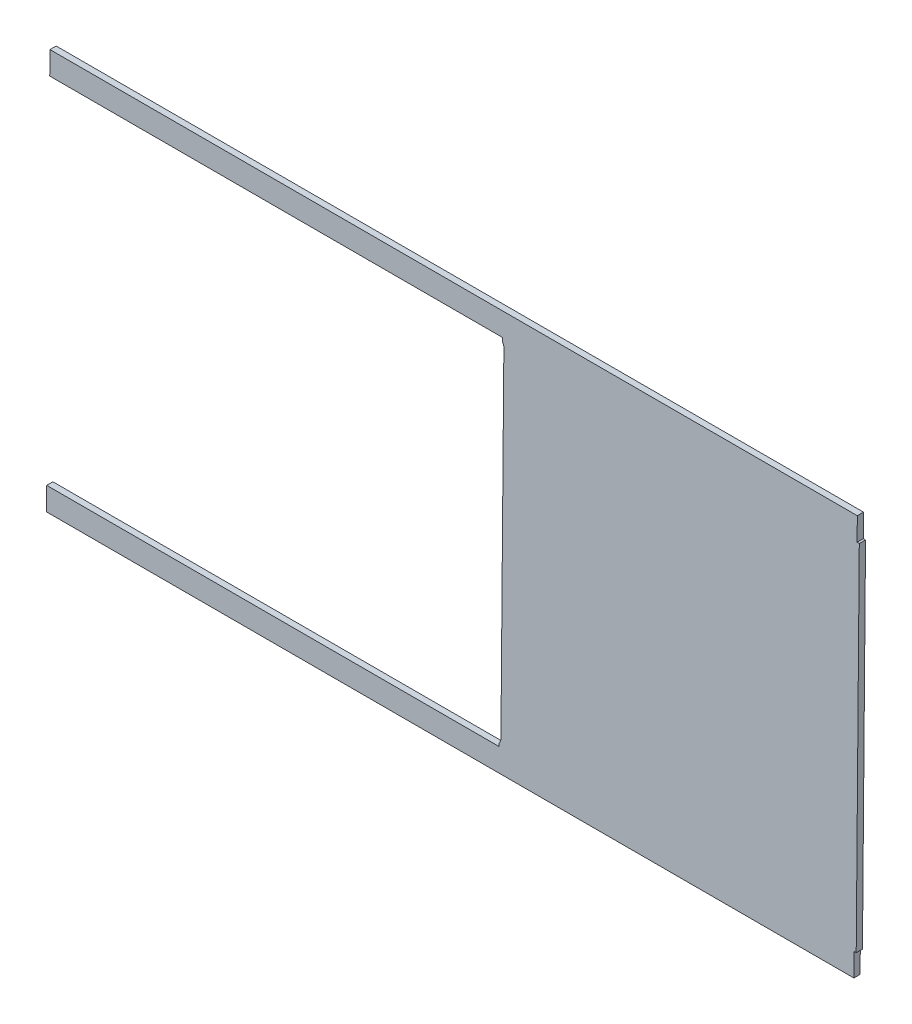
ISO-10303-21;
HEADER;
FILE_DESCRIPTION(('STEP AP214'),'2;1');
FILE_NAME('part.step','',(''),(''),'','','');
FILE_SCHEMA(('AUTOMOTIVE_DESIGN { 1 0 10303 214 1 1 1 1 }'));
ENDSEC;
DATA;
#1=APPLICATION_CONTEXT('core data for automotive mechanical design processes');
#2=APPLICATION_PROTOCOL_DEFINITION('international standard','automotive_design',2000,#1);
#3=PRODUCT_CONTEXT('',#1,'mechanical');
#4=PRODUCT('Part','Part','',(#3));
#5=PRODUCT_RELATED_PRODUCT_CATEGORY('part','',(#4));
#6=PRODUCT_DEFINITION_FORMATION('','',#4);
#7=PRODUCT_DEFINITION_CONTEXT('part definition',#1,'design');
#8=PRODUCT_DEFINITION('design','',#6,#7);
#9=PRODUCT_DEFINITION_SHAPE('','',#8);
#10=(LENGTH_UNIT() NAMED_UNIT(*) SI_UNIT(.MILLI.,.METRE.));
#11=(NAMED_UNIT(*) PLANE_ANGLE_UNIT() SI_UNIT($,.RADIAN.));
#12=(NAMED_UNIT(*) SI_UNIT($,.STERADIAN.) SOLID_ANGLE_UNIT());
#13=UNCERTAINTY_MEASURE_WITH_UNIT(LENGTH_MEASURE(1.E-05),#10,'distance_accuracy_value','');
#14=(GEOMETRIC_REPRESENTATION_CONTEXT(3) GLOBAL_UNCERTAINTY_ASSIGNED_CONTEXT((#13)) GLOBAL_UNIT_ASSIGNED_CONTEXT((#10,
#11,#12)) REPRESENTATION_CONTEXT('',''));
#15=CARTESIAN_POINT('',(0.,0.,0.));
#16=DIRECTION('',(0.,0.,1.));
#17=DIRECTION('',(1.,0.,0.));
#18=AXIS2_PLACEMENT_3D('',#15,#16,#17);
#19=CARTESIAN_POINT('',(-262.455348889824,521.616147879013,965.712017473714));
#20=DIRECTION('',(0.,0.999961923064171,-0.00872653549836404));
#21=DIRECTION('',(0.,0.00872653549836404,0.999961923064171));
#22=AXIS2_PLACEMENT_3D('',#19,#20,#21);
#23=PLANE('',#22);
#24=DIRECTION('',(-1.,0.,0.));
#25=VECTOR('',#24,1.);
#26=CARTESIAN_POINT('',(-262.455348889824,521.682957939778,973.367692151858));
#27=LINE('',#26,#25);
#28=CARTESIAN_POINT('',(448.544651110175,521.682957939778,973.367692151858));
#29=VERTEX_POINT('',#28);
#30=CARTESIAN_POINT('',(445.899457677506,521.682957939778,973.367692151857));
#31=VERTEX_POINT('',#30);
#32=EDGE_CURVE('E167',#29,#31,#27,.T.);
#33=ORIENTED_EDGE('',*,*,#32,.T.);
#34=DIRECTION('',(0.,0.00872653549836404,0.999961923064171));
#35=VECTOR('',#34,1.);
#36=CARTESIAN_POINT('',(445.899457677506,521.616147879013,965.712017473714));
#37=LINE('',#36,#35);
#38=CARTESIAN_POINT('',(445.899457677506,521.616147879013,965.712017473714));
#39=VERTEX_POINT('',#38);
#40=EDGE_CURVE('E36',#39,#31,#37,.T.);
#41=ORIENTED_EDGE('',*,*,#40,.F.);
#42=DIRECTION('',(-1.,0.,0.));
#43=VECTOR('',#42,1.);
#44=CARTESIAN_POINT('',(-262.455348889824,521.616147879013,965.712017473714));
#45=LINE('',#44,#43);
#46=CARTESIAN_POINT('',(448.544651110175,521.616147879013,965.712017473714));
#47=VERTEX_POINT('',#46);
#48=EDGE_CURVE('E279',#47,#39,#45,.T.);
#49=ORIENTED_EDGE('',*,*,#48,.F.);
#50=DIRECTION('',(0.,0.00872653549836404,0.999961923064171));
#51=VECTOR('',#50,1.);
#52=CARTESIAN_POINT('',(448.544651110175,521.616147879013,965.712017473714));
#53=LINE('',#52,#51);
#54=EDGE_CURVE('E10',#47,#29,#53,.T.);
#55=ORIENTED_EDGE('',*,*,#54,.T.);
#56=EDGE_LOOP('',(#33,#41,#49,#55));
#57=FACE_BOUND('',#56,.T.);
#58=ADVANCED_FACE('F16',(#57),#23,.F.);
#59=CARTESIAN_POINT('',(448.544651110175,737.607923260875,963.827085806067));
#60=DIRECTION('',(-1.,0.,0.));
#61=DIRECTION('',(0.,-1.,0.));
#62=AXIS2_PLACEMENT_3D('',#59,#60,#61);
#63=PLANE('',#62);
#64=DIRECTION('',(0.,-0.999961923064171,0.00872653549836403));
#65=VECTOR('',#64,1.);
#66=CARTESIAN_POINT('',(448.544651110175,737.67473332164,971.482760484211));
#67=LINE('',#66,#65);
#68=CARTESIAN_POINT('',(448.544651110175,953.6665087035,969.597828816564));
#69=VERTEX_POINT('',#68);
#70=EDGE_CURVE('E169',#69,#29,#67,.T.);
#71=ORIENTED_EDGE('',*,*,#70,.T.);
#72=ORIENTED_EDGE('',*,*,#54,.F.);
#73=DIRECTION('',(0.,-0.999961923064171,0.00872653549836403));
#74=VECTOR('',#73,1.);
#75=CARTESIAN_POINT('',(448.544651110175,737.607923260875,963.827085806067));
#76=LINE('',#75,#74);
#77=CARTESIAN_POINT('',(448.544651110175,953.599698642735,961.94215413842));
#78=VERTEX_POINT('',#77);
#79=EDGE_CURVE('E280',#78,#47,#76,.T.);
#80=ORIENTED_EDGE('',*,*,#79,.F.);
#81=DIRECTION('',(0.,0.00872653549836404,0.999961923064171));
#82=VECTOR('',#81,1.);
#83=CARTESIAN_POINT('',(448.544651110175,953.599698642735,961.94215413842));
#84=LINE('',#83,#82);
#85=EDGE_CURVE('E27',#78,#69,#84,.T.);
#86=ORIENTED_EDGE('',*,*,#85,.T.);
#87=EDGE_LOOP('',(#71,#72,#80,#86));
#88=FACE_BOUND('',#87,.T.);
#89=ADVANCED_FACE('F267',(#88),#63,.F.);
#90=CARTESIAN_POINT('',(-262.455348889824,953.599698642735,961.942154138421));
#91=DIRECTION('',(0.,-0.999961923064171,0.00872653549836404));
#92=DIRECTION('',(0.,-0.00872653549836404,-0.999961923064171));
#93=AXIS2_PLACEMENT_3D('',#90,#91,#92);
#94=PLANE('',#93);
#95=DIRECTION('',(1.,0.,0.));
#96=VECTOR('',#95,1.);
#97=CARTESIAN_POINT('',(-262.455348889824,953.6665087035,969.597828816564));
#98=LINE('',#97,#96);
#99=CARTESIAN_POINT('',(445.899457677506,953.6665087035,969.597828816564));
#100=VERTEX_POINT('',#99);
#101=EDGE_CURVE('E171',#100,#69,#98,.T.);
#102=ORIENTED_EDGE('',*,*,#101,.T.);
#103=ORIENTED_EDGE('',*,*,#85,.F.);
#104=DIRECTION('',(1.,0.,0.));
#105=VECTOR('',#104,1.);
#106=CARTESIAN_POINT('',(-262.455348889824,953.599698642735,961.942154138421));
#107=LINE('',#106,#105);
#108=CARTESIAN_POINT('',(445.899457677506,953.599698642735,961.94215413842));
#109=VERTEX_POINT('',#108);
#110=EDGE_CURVE('E282',#109,#78,#107,.T.);
#111=ORIENTED_EDGE('',*,*,#110,.F.);
#112=DIRECTION('',(0.,0.00872653549836404,0.999961923064171));
#113=VECTOR('',#112,1.);
#114=CARTESIAN_POINT('',(445.899457677506,953.599698642735,961.94215413842));
#115=LINE('',#114,#113);
#116=EDGE_CURVE('E232',#109,#100,#115,.T.);
#117=ORIENTED_EDGE('',*,*,#116,.T.);
#118=EDGE_LOOP('',(#102,#103,#111,#117));
#119=FACE_BOUND('',#118,.T.);
#120=ADVANCED_FACE('F265',(#119),#94,.F.);
#121=CARTESIAN_POINT('',(445.899457677506,737.607923260875,963.827085806067));
#122=DIRECTION('',(1.,0.,0.));
#123=DIRECTION('',(0.,1.,0.));
#124=AXIS2_PLACEMENT_3D('',#121,#122,#123);
#125=PLANE('',#124);
#126=DIRECTION('',(0.,0.999961923064171,-0.00872653549836403));
#127=VECTOR('',#126,1.);
#128=CARTESIAN_POINT('',(445.899457677506,737.67473332164,971.482760484211));
#129=LINE('',#128,#127);
#130=CARTESIAN_POINT('',(445.899457677506,981.665442549299,969.35348582261));
#131=VERTEX_POINT('',#130);
#132=EDGE_CURVE('E174',#100,#131,#129,.T.);
#133=ORIENTED_EDGE('',*,*,#132,.F.);
#134=ORIENTED_EDGE('',*,*,#116,.F.);
#135=DIRECTION('',(0.,0.999961923064171,-0.00872653549836403));
#136=VECTOR('',#135,1.);
#137=CARTESIAN_POINT('',(445.899457677506,737.607923260875,963.827085806067));
#138=LINE('',#137,#136);
#139=CARTESIAN_POINT('',(445.899457677506,981.598632488533,961.697811144466));
#140=VERTEX_POINT('',#139);
#141=EDGE_CURVE('E163',#109,#140,#138,.T.);
#142=ORIENTED_EDGE('',*,*,#141,.T.);
#143=DIRECTION('',(0.,0.00872653549836404,0.999961923064171));
#144=VECTOR('',#143,1.);
#145=CARTESIAN_POINT('',(445.899457677506,981.598632488533,961.697811144466));
#146=LINE('',#145,#144);
#147=EDGE_CURVE('E230',#140,#131,#146,.T.);
#148=ORIENTED_EDGE('',*,*,#147,.T.);
#149=EDGE_LOOP('',(#133,#134,#142,#148));
#150=FACE_BOUND('',#149,.T.);
#151=ADVANCED_FACE('F263',(#150),#125,.T.);
#152=CARTESIAN_POINT('',(-262.455348889824,981.598632488534,961.697811144466));
#153=DIRECTION('',(0.,0.999961923064171,-0.00872653549836404));
#154=DIRECTION('',(0.,0.00872653549836404,0.999961923064171));
#155=AXIS2_PLACEMENT_3D('',#152,#153,#154);
#156=PLANE('',#155);
#157=DIRECTION('',(-1.,0.,0.));
#158=VECTOR('',#157,1.);
#159=CARTESIAN_POINT('',(-262.455348889824,981.665442549299,969.35348582261));
#160=LINE('',#159,#158);
#161=CARTESIAN_POINT('',(-542.455348889824,981.665442549299,969.35348582261));
#162=VERTEX_POINT('',#161);
#163=EDGE_CURVE('E177',#131,#162,#160,.T.);
#164=ORIENTED_EDGE('',*,*,#163,.F.);
#165=ORIENTED_EDGE('',*,*,#147,.F.);
#166=DIRECTION('',(-1.,0.,0.));
#167=VECTOR('',#166,1.);
#168=CARTESIAN_POINT('',(-262.455348889824,981.598632488534,961.697811144466));
#169=LINE('',#168,#167);
#170=CARTESIAN_POINT('',(-542.455348889824,981.598632488534,961.697811144466));
#171=VERTEX_POINT('',#170);
#172=EDGE_CURVE('E288',#140,#171,#169,.T.);
#173=ORIENTED_EDGE('',*,*,#172,.T.);
#174=DIRECTION('',(0.,0.00872653549836404,0.999961923064171));
#175=VECTOR('',#174,1.);
#176=CARTESIAN_POINT('',(-542.455348889824,981.598632488534,961.697811144466));
#177=LINE('',#176,#175);
#178=EDGE_CURVE('E228',#171,#162,#177,.T.);
#179=ORIENTED_EDGE('',*,*,#178,.T.);
#180=EDGE_LOOP('',(#164,#165,#173,#179));
#181=FACE_BOUND('',#180,.T.);
#182=ADVANCED_FACE('F260',(#181),#156,.T.);
#183=CARTESIAN_POINT('',(-542.455348889824,737.607923260875,963.827085806067));
#184=DIRECTION('',(-1.,0.,0.));
#185=DIRECTION('',(0.,0.,1.));
#186=AXIS2_PLACEMENT_3D('',#183,#184,#185);
#187=PLANE('',#186);
#188=DIRECTION('',(0.,-0.999961923064171,0.00872653549836403));
#189=VECTOR('',#188,1.);
#190=CARTESIAN_POINT('',(-542.455348889824,737.67473332164,971.482760484211));
#191=LINE('',#190,#189);
#192=CARTESIAN_POINT('',(-542.455348889824,953.6665087035,969.597828816565));
#193=VERTEX_POINT('',#192);
#194=EDGE_CURVE('E181',#162,#193,#191,.T.);
#195=ORIENTED_EDGE('',*,*,#194,.F.);
#196=ORIENTED_EDGE('',*,*,#178,.F.);
#197=DIRECTION('',(0.,-0.999961923064171,0.00872653549836403));
#198=VECTOR('',#197,1.);
#199=CARTESIAN_POINT('',(-542.455348889824,737.607923260875,963.827085806067));
#200=LINE('',#199,#198);
#201=CARTESIAN_POINT('',(-542.455348889824,953.599698642735,961.942154138421));
#202=VERTEX_POINT('',#201);
#203=EDGE_CURVE('E157',#171,#202,#200,.T.);
#204=ORIENTED_EDGE('',*,*,#203,.T.);
#205=DIRECTION('',(0.,0.00872653549836404,0.999961923064171));
#206=VECTOR('',#205,1.);
#207=CARTESIAN_POINT('',(-542.455348889824,953.599698642735,961.942154138421));
#208=LINE('',#207,#206);
#209=EDGE_CURVE('E226',#202,#193,#208,.T.);
#210=ORIENTED_EDGE('',*,*,#209,.T.);
#211=EDGE_LOOP('',(#195,#196,#204,#210));
#212=FACE_BOUND('',#211,.T.);
#213=ADVANCED_FACE('F258',(#212),#187,.T.);
#214=CARTESIAN_POINT('',(-262.455348889824,953.599698642735,961.942154138421));
#215=DIRECTION('',(0.,-0.999961923064171,0.00872653549836404));
#216=DIRECTION('',(0.,-0.00872653549836404,-0.999961923064171));
#217=AXIS2_PLACEMENT_3D('',#214,#215,#216);
#218=PLANE('',#217);
#219=DIRECTION('',(1.,0.,0.));
#220=VECTOR('',#219,1.);
#221=CARTESIAN_POINT('',(-262.455348889824,953.6665087035,969.597828816564));
#222=LINE('',#221,#220);
#223=CARTESIAN_POINT('',(11.5446511101762,953.666508703501,969.597828816564));
#224=VERTEX_POINT('',#223);
#225=EDGE_CURVE('E184',#193,#224,#222,.T.);
#226=ORIENTED_EDGE('',*,*,#225,.F.);
#227=ORIENTED_EDGE('',*,*,#209,.F.);
#228=DIRECTION('',(1.,0.,0.));
#229=VECTOR('',#228,1.);
#230=CARTESIAN_POINT('',(-262.455348889824,953.599698642735,961.942154138421));
#231=LINE('',#230,#229);
#232=CARTESIAN_POINT('',(11.5446511101762,953.599698642736,961.94215413842));
#233=VERTEX_POINT('',#232);
#234=EDGE_CURVE('E292',#202,#233,#231,.T.);
#235=ORIENTED_EDGE('',*,*,#234,.T.);
#236=DIRECTION('',(0.,0.00872653549836404,0.999961923064171));
#237=VECTOR('',#236,1.);
#238=CARTESIAN_POINT('',(11.5446511101762,953.599698642736,961.94215413842));
#239=LINE('',#238,#237);
#240=EDGE_CURVE('E224',#233,#224,#239,.T.);
#241=ORIENTED_EDGE('',*,*,#240,.T.);
#242=EDGE_LOOP('',(#226,#227,#235,#241));
#243=FACE_BOUND('',#242,.T.);
#244=ADVANCED_FACE('F255',(#243),#218,.T.);
#245=CARTESIAN_POINT('',(11.544651110176,737.607923260875,963.827085806067));
#246=DIRECTION('',(-1.,0.,0.));
#247=DIRECTION('',(0.,-1.,0.));
#248=AXIS2_PLACEMENT_3D('',#245,#246,#247);
#249=PLANE('',#248);
#250=DIRECTION('',(0.,-0.999961923064171,0.00872653549836403));
#251=VECTOR('',#250,1.);
#252=CARTESIAN_POINT('',(11.5446511101761,737.67473332164,971.482760484211));
#253=LINE('',#252,#251);
#254=CARTESIAN_POINT('',(11.5446511101762,949.66666973778,969.632734882402));
#255=VERTEX_POINT('',#254);
#256=EDGE_CURVE('E188',#224,#255,#253,.T.);
#257=ORIENTED_EDGE('',*,*,#256,.F.);
#258=ORIENTED_EDGE('',*,*,#240,.F.);
#259=DIRECTION('',(0.,-0.999961923064171,0.00872653549836403));
#260=VECTOR('',#259,1.);
#261=CARTESIAN_POINT('',(11.544651110176,737.607923260875,963.827085806067));
#262=LINE('',#261,#260);
#263=CARTESIAN_POINT('',(11.5446511101762,949.599859677015,961.977060204259));
#264=VERTEX_POINT('',#263);
#265=EDGE_CURVE('E295',#233,#264,#262,.T.);
#266=ORIENTED_EDGE('',*,*,#265,.T.);
#267=CARTESIAN_POINT('',(11.5446511101762,949.599859677015,961.977060204259));
#268=DIRECTION('',(0.,0.00872653549836374,0.999961923064171));
#269=VECTOR('',#268,1.);
#270=LINE('',#267,#269);
#271=EDGE_CURVE('E223',#264,#255,#270,.T.);
#272=ORIENTED_EDGE('',*,*,#271,.T.);
#273=EDGE_LOOP('',(#257,#258,#266,#272));
#274=FACE_BOUND('',#273,.T.);
#275=ADVANCED_FACE('F253',(#274),#249,.T.);
#276=CARTESIAN_POINT('',(3.5446511101762,943.600079412094,962.029419493404));
#277=DIRECTION('',(0.,0.00872653549836404,0.999961923064171));
#278=DIRECTION('',(0.,-0.999961923064171,0.00872653549836404));
#279=AXIS2_PLACEMENT_3D('',#276,#277,#278);
#280=CYLINDRICAL_SURFACE('',#279,10.);
#281=CARTESIAN_POINT('',(3.5446511101762,943.666889472859,969.685094171548));
#282=DIRECTION('',(0.,0.00872653549836403,0.999961923064171));
#283=DIRECTION('',(0.,-0.999961923064171,0.00872653549836403));
#284=AXIS2_PLACEMENT_3D('',#281,#282,#283);
#285=CIRCLE('',#284,10.);
#286=CARTESIAN_POINT('',(13.5446511101762,943.666889472859,969.685094171548));
#287=VERTEX_POINT('',#286);
#288=EDGE_CURVE('E193',#287,#255,#285,.T.);
#289=ORIENTED_EDGE('',*,*,#288,.T.);
#290=ORIENTED_EDGE('',*,*,#271,.F.);
#291=CARTESIAN_POINT('',(3.5446511101762,943.600079412094,962.029419493404));
#292=DIRECTION('',(0.,0.00872653549836403,0.999961923064171));
#293=DIRECTION('',(0.,-0.999961923064171,0.00872653549836403));
#294=AXIS2_PLACEMENT_3D('',#291,#292,#293);
#295=CIRCLE('',#294,10.);
#296=CARTESIAN_POINT('',(13.5446511101762,943.600079412094,962.029419493404));
#297=VERTEX_POINT('',#296);
#298=EDGE_CURVE('E299',#297,#264,#295,.T.);
#299=ORIENTED_EDGE('',*,*,#298,.F.);
#300=DIRECTION('',(0.,0.00872653549836404,0.999961923064171));
#301=VECTOR('',#300,1.);
#302=CARTESIAN_POINT('',(13.5446511101762,943.600079412094,962.029419493404));
#303=LINE('',#302,#301);
#304=EDGE_CURVE('E221',#297,#287,#303,.T.);
#305=ORIENTED_EDGE('',*,*,#304,.T.);
#306=EDGE_LOOP('',(#289,#290,#299,#305));
#307=FACE_BOUND('',#306,.T.);
#308=ADVANCED_FACE('F242',(#307),#280,.F.);
#309=CARTESIAN_POINT('',(13.5446511101761,737.607923260875,963.827085806067));
#310=DIRECTION('',(-1.,0.,0.));
#311=DIRECTION('',(0.,-1.,0.));
#312=AXIS2_PLACEMENT_3D('',#309,#310,#311);
#313=PLANE('',#312);
#314=DIRECTION('',(0.,-0.999961923064171,0.00872653549836403));
#315=VECTOR('',#314,1.);
#316=CARTESIAN_POINT('',(13.5446511101761,737.67473332164,971.482760484211));
#317=LINE('',#316,#315);
#318=CARTESIAN_POINT('',(13.544651110176,531.682577170421,973.280426796874));
#319=VERTEX_POINT('',#318);
#320=EDGE_CURVE('E202',#287,#319,#317,.T.);
#321=ORIENTED_EDGE('',*,*,#320,.F.);
#322=ORIENTED_EDGE('',*,*,#304,.F.);
#323=DIRECTION('',(0.,-0.999961923064171,0.00872653549836403));
#324=VECTOR('',#323,1.);
#325=CARTESIAN_POINT('',(13.5446511101761,737.607923260875,963.827085806067));
#326=LINE('',#325,#324);
#327=CARTESIAN_POINT('',(13.544651110176,531.615767109656,965.62475211873));
#328=VERTEX_POINT('',#327);
#329=EDGE_CURVE('E307',#297,#328,#326,.T.);
#330=ORIENTED_EDGE('',*,*,#329,.T.);
#331=DIRECTION('',(0.,0.00872653549836404,0.999961923064171));
#332=VECTOR('',#331,1.);
#333=CARTESIAN_POINT('',(13.544651110176,531.615767109656,965.62475211873));
#334=LINE('',#333,#332);
#335=EDGE_CURVE('E219',#328,#319,#334,.T.);
#336=ORIENTED_EDGE('',*,*,#335,.T.);
#337=EDGE_LOOP('',(#321,#322,#330,#336));
#338=FACE_BOUND('',#337,.T.);
#339=ADVANCED_FACE('F252',(#338),#313,.T.);
#340=CARTESIAN_POINT('',(3.54465111017596,531.615767109656,965.62475211873));
#341=DIRECTION('',(0.,0.00872653549836404,0.999961923064171));
#342=DIRECTION('',(0.,-0.999961923064171,0.00872653549836404));
#343=AXIS2_PLACEMENT_3D('',#340,#341,#342);
#344=CYLINDRICAL_SURFACE('',#343,10.);
#345=CARTESIAN_POINT('',(3.54465111017596,531.682577170421,973.280426796874));
#346=DIRECTION('',(0.,0.00872653549836403,0.999961923064171));
#347=DIRECTION('',(0.,-0.999961923064171,0.00872653549836403));
#348=AXIS2_PLACEMENT_3D('',#345,#346,#347);
#349=CIRCLE('',#348,10.);
#350=CARTESIAN_POINT('',(11.5446511101759,525.682805632036,973.332786009864));
#351=VERTEX_POINT('',#350);
#352=EDGE_CURVE('E199',#351,#319,#349,.T.);
#353=ORIENTED_EDGE('',*,*,#352,.T.);
#354=ORIENTED_EDGE('',*,*,#335,.F.);
#355=CARTESIAN_POINT('',(3.54465111017596,531.615767109656,965.62475211873));
#356=DIRECTION('',(0.,0.00872653549836403,0.999961923064171));
#357=DIRECTION('',(0.,-0.999961923064171,0.00872653549836403));
#358=AXIS2_PLACEMENT_3D('',#355,#356,#357);
#359=CIRCLE('',#358,10.);
#360=CARTESIAN_POINT('',(11.5446511101759,525.61599557127,965.67711133172));
#361=VERTEX_POINT('',#360);
#362=EDGE_CURVE('E304',#361,#328,#359,.T.);
#363=ORIENTED_EDGE('',*,*,#362,.F.);
#364=DIRECTION('',(0.,0.00872653549836404,0.999961923064171));
#365=VECTOR('',#364,1.);
#366=CARTESIAN_POINT('',(11.5446511101759,525.61599557127,965.67711133172));
#367=LINE('',#366,#365);
#368=EDGE_CURVE('E217',#361,#351,#367,.T.);
#369=ORIENTED_EDGE('',*,*,#368,.T.);
#370=EDGE_LOOP('',(#353,#354,#363,#369));
#371=FACE_BOUND('',#370,.T.);
#372=ADVANCED_FACE('F316',(#371),#344,.F.);
#373=CARTESIAN_POINT('',(11.5446511101759,521.682957939779,973.367692151857));
#374=VERTEX_POINT('',#373);
#375=EDGE_CURVE('E194',#351,#374,#253,.T.);
#376=ORIENTED_EDGE('',*,*,#375,.F.);
#377=ORIENTED_EDGE('',*,*,#368,.F.);
#378=CARTESIAN_POINT('',(11.5446511101759,521.616147879014,965.712017473714));
#379=VERTEX_POINT('',#378);
#380=EDGE_CURVE('E300',#361,#379,#262,.T.);
#381=ORIENTED_EDGE('',*,*,#380,.T.);
#382=DIRECTION('',(0.,0.00872653549836404,0.999961923064171));
#383=VECTOR('',#382,1.);
#384=CARTESIAN_POINT('',(11.5446511101759,521.616147879014,965.712017473714));
#385=LINE('',#384,#383);
#386=EDGE_CURVE('E215',#379,#374,#385,.T.);
#387=ORIENTED_EDGE('',*,*,#386,.T.);
#388=EDGE_LOOP('',(#376,#377,#381,#387));
#389=FACE_BOUND('',#388,.T.);
#390=ADVANCED_FACE('F338',(#389),#249,.T.);
#391=CARTESIAN_POINT('',(-262.455348889824,521.616147879013,965.712017473714));
#392=DIRECTION('',(0.,0.999961923064171,-0.00872653549836404));
#393=DIRECTION('',(0.,0.00872653549836404,0.999961923064171));
#394=AXIS2_PLACEMENT_3D('',#391,#392,#393);
#395=PLANE('',#394);
#396=DIRECTION('',(-1.,0.,0.));
#397=VECTOR('',#396,1.);
#398=CARTESIAN_POINT('',(-262.455348889824,521.682957939778,973.367692151858));
#399=LINE('',#398,#397);
#400=CARTESIAN_POINT('',(-542.455348889824,521.682957939778,973.367692151858));
#401=VERTEX_POINT('',#400);
#402=EDGE_CURVE('E198',#374,#401,#399,.T.);
#403=ORIENTED_EDGE('',*,*,#402,.F.);
#404=ORIENTED_EDGE('',*,*,#386,.F.);
#405=DIRECTION('',(-1.,0.,0.));
#406=VECTOR('',#405,1.);
#407=CARTESIAN_POINT('',(-262.455348889824,521.616147879013,965.712017473714));
#408=LINE('',#407,#406);
#409=CARTESIAN_POINT('',(-542.455348889824,521.616147879013,965.712017473714));
#410=VERTEX_POINT('',#409);
#411=EDGE_CURVE('E155',#379,#410,#408,.T.);
#412=ORIENTED_EDGE('',*,*,#411,.T.);
#413=DIRECTION('',(0.,0.00872653549836404,0.999961923064171));
#414=VECTOR('',#413,1.);
#415=CARTESIAN_POINT('',(-542.455348889824,521.616147879013,965.712017473714));
#416=LINE('',#415,#414);
#417=EDGE_CURVE('E147',#410,#401,#416,.T.);
#418=ORIENTED_EDGE('',*,*,#417,.T.);
#419=EDGE_LOOP('',(#403,#404,#412,#418));
#420=FACE_BOUND('',#419,.T.);
#421=ADVANCED_FACE('F340',(#420),#395,.T.);
#422=CARTESIAN_POINT('',(-542.455348889824,493.684024093982,973.612035145812));
#423=VERTEX_POINT('',#422);
#424=EDGE_CURVE('E185',#401,#423,#191,.T.);
#425=ORIENTED_EDGE('',*,*,#424,.F.);
#426=ORIENTED_EDGE('',*,*,#417,.F.);
#427=CARTESIAN_POINT('',(-542.455348889824,493.617214033217,965.956360467668));
#428=VERTEX_POINT('',#427);
#429=EDGE_CURVE('E150',#410,#428,#200,.T.);
#430=ORIENTED_EDGE('',*,*,#429,.T.);
#431=DIRECTION('',(0.,0.00872653549836404,0.999961923064171));
#432=VECTOR('',#431,1.);
#433=CARTESIAN_POINT('',(-542.455348889824,493.617214033217,965.956360467668));
#434=LINE('',#433,#432);
#435=EDGE_CURVE('E136',#428,#423,#434,.T.);
#436=ORIENTED_EDGE('',*,*,#435,.T.);
#437=EDGE_LOOP('',(#425,#426,#430,#436));
#438=FACE_BOUND('',#437,.T.);
#439=ADVANCED_FACE('F151',(#438),#187,.T.);
#440=CARTESIAN_POINT('',(-262.455348889824,493.617214033217,965.956360467668));
#441=DIRECTION('',(0.,-0.999961923064171,0.00872653549836404));
#442=DIRECTION('',(0.,-0.00872653549836404,-0.999961923064171));
#443=AXIS2_PLACEMENT_3D('',#440,#441,#442);
#444=PLANE('',#443);
#445=DIRECTION('',(1.,0.,0.));
#446=VECTOR('',#445,1.);
#447=CARTESIAN_POINT('',(-262.455348889824,493.684024093982,973.612035145812));
#448=LINE('',#447,#446);
#449=CARTESIAN_POINT('',(445.899457677506,493.684024093982,973.612035145812));
#450=VERTEX_POINT('',#449);
#451=EDGE_CURVE('E143',#423,#450,#448,.T.);
#452=ORIENTED_EDGE('',*,*,#451,.F.);
#453=ORIENTED_EDGE('',*,*,#435,.F.);
#454=DIRECTION('',(1.,0.,0.));
#455=VECTOR('',#454,1.);
#456=CARTESIAN_POINT('',(-262.455348889824,493.617214033217,965.956360467668));
#457=LINE('',#456,#455);
#458=CARTESIAN_POINT('',(445.899457677506,493.617214033217,965.956360467668));
#459=VERTEX_POINT('',#458);
#460=EDGE_CURVE('E140',#428,#459,#457,.T.);
#461=ORIENTED_EDGE('',*,*,#460,.T.);
#462=DIRECTION('',(0.,0.00872653549836404,0.999961923064171));
#463=VECTOR('',#462,1.);
#464=CARTESIAN_POINT('',(445.899457677506,493.617214033217,965.956360467668));
#465=LINE('',#464,#463);
#466=EDGE_CURVE('E88',#459,#450,#465,.T.);
#467=ORIENTED_EDGE('',*,*,#466,.T.);
#468=EDGE_LOOP('',(#452,#453,#461,#467));
#469=FACE_BOUND('',#468,.T.);
#470=ADVANCED_FACE('F138',(#469),#444,.T.);
#471=EDGE_CURVE('E178',#450,#31,#129,.T.);
#472=ORIENTED_EDGE('',*,*,#471,.F.);
#473=ORIENTED_EDGE('',*,*,#466,.F.);
#474=EDGE_CURVE('E160',#459,#39,#138,.T.);
#475=ORIENTED_EDGE('',*,*,#474,.T.);
#476=ORIENTED_EDGE('',*,*,#40,.T.);
#477=EDGE_LOOP('',(#472,#473,#475,#476));
#478=FACE_BOUND('',#477,.T.);
#479=ADVANCED_FACE('F386',(#478),#125,.T.);
#480=CARTESIAN_POINT('',(-262.455348889824,737.607923260875,963.827085806067));
#481=DIRECTION('',(0.,0.00872653549836403,0.999961923064171));
#482=DIRECTION('',(-1.,0.,0.));
#483=AXIS2_PLACEMENT_3D('',#480,#481,#482);
#484=PLANE('',#483);
#485=ORIENTED_EDGE('',*,*,#48,.T.);
#486=ORIENTED_EDGE('',*,*,#474,.F.);
#487=ORIENTED_EDGE('',*,*,#460,.F.);
#488=ORIENTED_EDGE('',*,*,#429,.F.);
#489=ORIENTED_EDGE('',*,*,#411,.F.);
#490=ORIENTED_EDGE('',*,*,#380,.F.);
#491=ORIENTED_EDGE('',*,*,#362,.T.);
#492=ORIENTED_EDGE('',*,*,#329,.F.);
#493=ORIENTED_EDGE('',*,*,#298,.T.);
#494=ORIENTED_EDGE('',*,*,#265,.F.);
#495=ORIENTED_EDGE('',*,*,#234,.F.);
#496=ORIENTED_EDGE('',*,*,#203,.F.);
#497=ORIENTED_EDGE('',*,*,#172,.F.);
#498=ORIENTED_EDGE('',*,*,#141,.F.);
#499=ORIENTED_EDGE('',*,*,#110,.T.);
#500=ORIENTED_EDGE('',*,*,#79,.T.);
#501=EDGE_LOOP('',(#485,#486,#487,#488,#489,#490,#491,#492,#493,#494,#495,#496,#497,#498,#499,#500));
#502=FACE_BOUND('',#501,.T.);
#503=ADVANCED_FACE('F159',(#502),#484,.F.);
#504=CARTESIAN_POINT('',(-262.455348889824,737.67473332164,971.482760484211));
#505=DIRECTION('',(0.,0.00872653549836403,0.999961923064171));
#506=DIRECTION('',(-1.,0.,0.));
#507=AXIS2_PLACEMENT_3D('',#504,#505,#506);
#508=PLANE('',#507);
#509=ORIENTED_EDGE('',*,*,#32,.F.);
#510=ORIENTED_EDGE('',*,*,#70,.F.);
#511=ORIENTED_EDGE('',*,*,#101,.F.);
#512=ORIENTED_EDGE('',*,*,#132,.T.);
#513=ORIENTED_EDGE('',*,*,#163,.T.);
#514=ORIENTED_EDGE('',*,*,#194,.T.);
#515=ORIENTED_EDGE('',*,*,#225,.T.);
#516=ORIENTED_EDGE('',*,*,#256,.T.);
#517=ORIENTED_EDGE('',*,*,#288,.F.);
#518=ORIENTED_EDGE('',*,*,#320,.T.);
#519=ORIENTED_EDGE('',*,*,#352,.F.);
#520=ORIENTED_EDGE('',*,*,#375,.T.);
#521=ORIENTED_EDGE('',*,*,#402,.T.);
#522=ORIENTED_EDGE('',*,*,#424,.T.);
#523=ORIENTED_EDGE('',*,*,#451,.T.);
#524=ORIENTED_EDGE('',*,*,#471,.T.);
#525=EDGE_LOOP('',(#509,#510,#511,#512,#513,#514,#515,#516,#517,#518,#519,#520,#521,#522,#523,#524));
#526=FACE_BOUND('',#525,.T.);
#527=ADVANCED_FACE('F278',(#526),#508,.T.);
#528=CLOSED_SHELL('',(#58,#89,#120,#151,#182,#213,#244,#275,#308,#339,#372,#390,#421,#439,#470,
#479,#503,#527));
#529=MANIFOLD_SOLID_BREP('B1',#528);
#530=ADVANCED_BREP_SHAPE_REPRESENTATION('',(#18,#529),#14);
#531=SHAPE_DEFINITION_REPRESENTATION(#9,#530);
ENDSEC;
END-ISO-10303-21;
